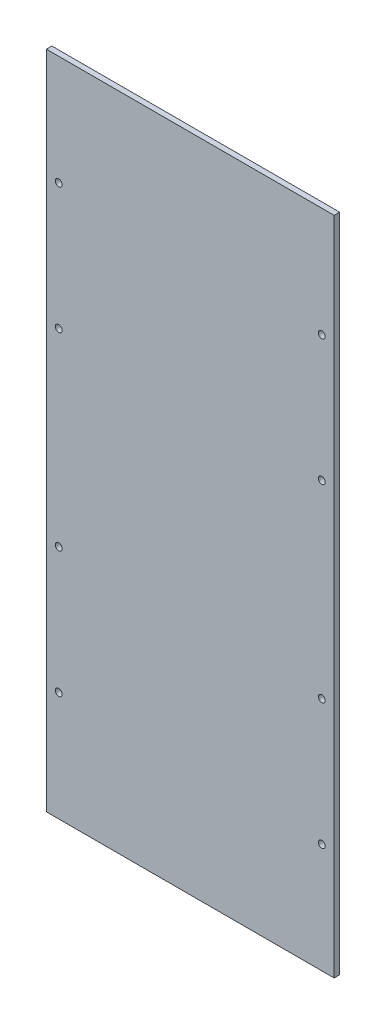
ISO-10303-21;
HEADER;
FILE_DESCRIPTION(('STEP AP214'),'2;1');
FILE_NAME('part.step','',(''),(''),'','','');
FILE_SCHEMA(('AUTOMOTIVE_DESIGN { 1 0 10303 214 1 1 1 1 }'));
ENDSEC;
DATA;
#1=APPLICATION_CONTEXT('core data for automotive mechanical design processes');
#2=APPLICATION_PROTOCOL_DEFINITION('international standard','automotive_design',2000,#1);
#3=PRODUCT_CONTEXT('',#1,'mechanical');
#4=PRODUCT('Part','Part','',(#3));
#5=PRODUCT_RELATED_PRODUCT_CATEGORY('part','',(#4));
#6=PRODUCT_DEFINITION_FORMATION('','',#4);
#7=PRODUCT_DEFINITION_CONTEXT('part definition',#1,'design');
#8=PRODUCT_DEFINITION('design','',#6,#7);
#9=PRODUCT_DEFINITION_SHAPE('','',#8);
#10=(LENGTH_UNIT() NAMED_UNIT(*) SI_UNIT(.MILLI.,.METRE.));
#11=(NAMED_UNIT(*) PLANE_ANGLE_UNIT() SI_UNIT($,.RADIAN.));
#12=(NAMED_UNIT(*) SI_UNIT($,.STERADIAN.) SOLID_ANGLE_UNIT());
#13=UNCERTAINTY_MEASURE_WITH_UNIT(LENGTH_MEASURE(1.E-05),#10,'distance_accuracy_value','');
#14=(GEOMETRIC_REPRESENTATION_CONTEXT(3) GLOBAL_UNCERTAINTY_ASSIGNED_CONTEXT((#13)) GLOBAL_UNIT_ASSIGNED_CONTEXT((#10,
#11,#12)) REPRESENTATION_CONTEXT('',''));
#15=CARTESIAN_POINT('',(0.,0.,0.));
#16=DIRECTION('',(0.,0.,1.));
#17=DIRECTION('',(1.,0.,0.));
#18=AXIS2_PLACEMENT_3D('',#15,#16,#17);
#19=CARTESIAN_POINT('',(0.,0.,4.));
#20=DIRECTION('',(0.,0.,-1.));
#21=DIRECTION('',(-1.,0.,0.));
#22=AXIS2_PLACEMENT_3D('',#19,#20,#21);
#23=PLANE('',#22);
#24=DIRECTION('',(0.,-1.,0.));
#25=VECTOR('',#24,1.);
#26=CARTESIAN_POINT('',(-90.5016149039087,703.628389677579,4.));
#27=LINE('',#26,#25);
#28=CARTESIAN_POINT('',(-90.5016149039087,1185.62838967758,4.));
#29=VERTEX_POINT('',#28);
#30=CARTESIAN_POINT('',(-90.5016149039087,703.628389677579,4.));
#31=VERTEX_POINT('',#30);
#32=EDGE_CURVE('E85',#29,#31,#27,.T.);
#33=ORIENTED_EDGE('',*,*,#32,.T.);
#34=DIRECTION('',(1.,0.,0.));
#35=VECTOR('',#34,1.);
#36=CARTESIAN_POINT('',(-90.5016149039087,703.628389677579,4.));
#37=LINE('',#36,#35);
#38=CARTESIAN_POINT('',(119.498385096091,703.628389677579,4.));
#39=VERTEX_POINT('',#38);
#40=EDGE_CURVE('E80',#31,#39,#37,.T.);
#41=ORIENTED_EDGE('',*,*,#40,.T.);
#42=DIRECTION('',(0.,1.,0.));
#43=VECTOR('',#42,1.);
#44=CARTESIAN_POINT('',(119.498385096091,703.628389677579,4.));
#45=LINE('',#44,#43);
#46=CARTESIAN_POINT('',(119.498385096091,1185.62838967758,4.));
#47=VERTEX_POINT('',#46);
#48=EDGE_CURVE('E83',#39,#47,#45,.T.);
#49=ORIENTED_EDGE('',*,*,#48,.T.);
#50=DIRECTION('',(-1.,0.,0.));
#51=VECTOR('',#50,1.);
#52=CARTESIAN_POINT('',(-90.5016149039087,1185.62838967758,4.));
#53=LINE('',#52,#51);
#54=EDGE_CURVE('E50',#47,#29,#53,.T.);
#55=ORIENTED_EDGE('',*,*,#54,.T.);
#56=EDGE_LOOP('',(#33,#41,#49,#55));
#57=FACE_BOUND('',#56,.T.);
#58=CARTESIAN_POINT('',(110.498385096091,1105.63838967758,4.));
#59=DIRECTION('',(0.,0.,1.));
#60=DIRECTION('',(1.,0.,0.));
#61=AXIS2_PLACEMENT_3D('',#58,#59,#60);
#62=CIRCLE('',#61,2.49999999999996);
#63=CARTESIAN_POINT('',(112.998385096091,1105.63838967758,4.));
#64=VERTEX_POINT('',#63);
#65=EDGE_CURVE('E100',#64,#64,#62,.T.);
#66=ORIENTED_EDGE('',*,*,#65,.F.);
#67=EDGE_LOOP('',(#66));
#68=FACE_BOUND('',#67,.T.);
#69=CARTESIAN_POINT('',(-81.5016149039087,1105.63838967758,4.));
#70=DIRECTION('',(0.,0.,1.));
#71=DIRECTION('',(1.,0.,0.));
#72=AXIS2_PLACEMENT_3D('',#69,#70,#71);
#73=CIRCLE('',#72,2.50000000000004);
#74=CARTESIAN_POINT('',(-79.0016149039087,1105.63838967758,4.));
#75=VERTEX_POINT('',#74);
#76=EDGE_CURVE('E115',#75,#75,#73,.T.);
#77=ORIENTED_EDGE('',*,*,#76,.F.);
#78=EDGE_LOOP('',(#77));
#79=FACE_BOUND('',#78,.T.);
#80=CARTESIAN_POINT('',(-81.5016149039087,1013.63838967758,4.));
#81=DIRECTION('',(0.,0.,1.));
#82=DIRECTION('',(1.,0.,0.));
#83=AXIS2_PLACEMENT_3D('',#80,#81,#82);
#84=CIRCLE('',#83,2.49999999999991);
#85=CARTESIAN_POINT('',(-79.0016149039088,1013.63838967758,4.));
#86=VERTEX_POINT('',#85);
#87=EDGE_CURVE('E121',#86,#86,#84,.T.);
#88=ORIENTED_EDGE('',*,*,#87,.F.);
#89=EDGE_LOOP('',(#88));
#90=FACE_BOUND('',#89,.T.);
#91=CARTESIAN_POINT('',(110.498385096091,1013.63838967758,4.));
#92=DIRECTION('',(0.,0.,1.));
#93=DIRECTION('',(1.,0.,0.));
#94=AXIS2_PLACEMENT_3D('',#91,#92,#93);
#95=CIRCLE('',#94,2.50000000000021);
#96=CARTESIAN_POINT('',(112.998385096092,1013.63838967758,4.));
#97=VERTEX_POINT('',#96);
#98=EDGE_CURVE('E127',#97,#97,#95,.T.);
#99=ORIENTED_EDGE('',*,*,#98,.F.);
#100=EDGE_LOOP('',(#99));
#101=FACE_BOUND('',#100,.T.);
#102=CARTESIAN_POINT('',(-81.5016149039087,875.618389677579,4.));
#103=DIRECTION('',(0.,0.,1.));
#104=DIRECTION('',(1.,0.,0.));
#105=AXIS2_PLACEMENT_3D('',#102,#103,#104);
#106=CIRCLE('',#105,2.49999999999992);
#107=CARTESIAN_POINT('',(-79.0016149039088,875.618389677579,4.));
#108=VERTEX_POINT('',#107);
#109=EDGE_CURVE('E133',#108,#108,#106,.T.);
#110=ORIENTED_EDGE('',*,*,#109,.F.);
#111=EDGE_LOOP('',(#110));
#112=FACE_BOUND('',#111,.T.);
#113=CARTESIAN_POINT('',(110.498385096091,783.618389677579,4.));
#114=DIRECTION('',(0.,0.,1.));
#115=DIRECTION('',(1.,0.,0.));
#116=AXIS2_PLACEMENT_3D('',#113,#114,#115);
#117=CIRCLE('',#116,2.49999999999998);
#118=CARTESIAN_POINT('',(112.998385096091,783.618389677579,4.));
#119=VERTEX_POINT('',#118);
#120=EDGE_CURVE('E139',#119,#119,#117,.T.);
#121=ORIENTED_EDGE('',*,*,#120,.F.);
#122=EDGE_LOOP('',(#121));
#123=FACE_BOUND('',#122,.T.);
#124=CARTESIAN_POINT('',(-81.5016149039087,783.618389677579,4.));
#125=DIRECTION('',(0.,0.,1.));
#126=DIRECTION('',(1.,0.,0.));
#127=AXIS2_PLACEMENT_3D('',#124,#125,#126);
#128=CIRCLE('',#127,2.50000000000006);
#129=CARTESIAN_POINT('',(-79.0016149039087,783.618389677579,4.));
#130=VERTEX_POINT('',#129);
#131=EDGE_CURVE('E145',#130,#130,#128,.T.);
#132=ORIENTED_EDGE('',*,*,#131,.F.);
#133=EDGE_LOOP('',(#132));
#134=FACE_BOUND('',#133,.T.);
#135=CARTESIAN_POINT('',(110.498385096091,875.618389677579,4.));
#136=DIRECTION('',(0.,0.,1.));
#137=DIRECTION('',(1.,0.,0.));
#138=AXIS2_PLACEMENT_3D('',#135,#136,#137);
#139=CIRCLE('',#138,2.50000000000001);
#140=CARTESIAN_POINT('',(112.998385096091,875.618389677579,4.));
#141=VERTEX_POINT('',#140);
#142=EDGE_CURVE('E151',#141,#141,#139,.T.);
#143=ORIENTED_EDGE('',*,*,#142,.F.);
#144=EDGE_LOOP('',(#143));
#145=FACE_BOUND('',#144,.T.);
#146=ADVANCED_FACE('F33',(#57,#68,#79,#90,#101,#112,#123,#134,#145),#23,.F.);
#147=CARTESIAN_POINT('',(0.,0.,0.));
#148=DIRECTION('',(0.,0.,-1.));
#149=DIRECTION('',(-1.,0.,0.));
#150=AXIS2_PLACEMENT_3D('',#147,#148,#149);
#151=PLANE('',#150);
#152=CARTESIAN_POINT('',(-81.5016149039087,783.618389677579,0.));
#153=DIRECTION('',(0.,0.,1.));
#154=DIRECTION('',(1.,0.,0.));
#155=AXIS2_PLACEMENT_3D('',#152,#153,#154);
#156=CIRCLE('',#155,2.50000000000006);
#157=CARTESIAN_POINT('',(-79.0016149039087,783.618389677579,0.));
#158=VERTEX_POINT('',#157);
#159=EDGE_CURVE('E148',#158,#158,#156,.T.);
#160=ORIENTED_EDGE('',*,*,#159,.T.);
#161=EDGE_LOOP('',(#160));
#162=FACE_BOUND('',#161,.T.);
#163=CARTESIAN_POINT('',(-81.5016149039087,875.618389677579,0.));
#164=DIRECTION('',(0.,0.,1.));
#165=DIRECTION('',(1.,0.,0.));
#166=AXIS2_PLACEMENT_3D('',#163,#164,#165);
#167=CIRCLE('',#166,2.49999999999992);
#168=CARTESIAN_POINT('',(-79.0016149039088,875.618389677579,0.));
#169=VERTEX_POINT('',#168);
#170=EDGE_CURVE('E136',#169,#169,#167,.T.);
#171=ORIENTED_EDGE('',*,*,#170,.T.);
#172=EDGE_LOOP('',(#171));
#173=FACE_BOUND('',#172,.T.);
#174=CARTESIAN_POINT('',(-81.5016149039087,1013.63838967758,0.));
#175=DIRECTION('',(0.,0.,1.));
#176=DIRECTION('',(1.,0.,0.));
#177=AXIS2_PLACEMENT_3D('',#174,#175,#176);
#178=CIRCLE('',#177,2.49999999999991);
#179=CARTESIAN_POINT('',(-79.0016149039088,1013.63838967758,0.));
#180=VERTEX_POINT('',#179);
#181=EDGE_CURVE('E124',#180,#180,#178,.T.);
#182=ORIENTED_EDGE('',*,*,#181,.T.);
#183=EDGE_LOOP('',(#182));
#184=FACE_BOUND('',#183,.T.);
#185=CARTESIAN_POINT('',(110.498385096091,1105.63838967758,0.));
#186=DIRECTION('',(0.,0.,1.));
#187=DIRECTION('',(1.,0.,0.));
#188=AXIS2_PLACEMENT_3D('',#185,#186,#187);
#189=CIRCLE('',#188,2.49999999999996);
#190=CARTESIAN_POINT('',(112.998385096091,1105.63838967758,0.));
#191=VERTEX_POINT('',#190);
#192=EDGE_CURVE('E112',#191,#191,#189,.T.);
#193=ORIENTED_EDGE('',*,*,#192,.T.);
#194=EDGE_LOOP('',(#193));
#195=FACE_BOUND('',#194,.T.);
#196=DIRECTION('',(0.,-1.,0.));
#197=VECTOR('',#196,1.);
#198=CARTESIAN_POINT('',(-90.5016149039087,703.628389677579,0.));
#199=LINE('',#198,#197);
#200=CARTESIAN_POINT('',(-90.5016149039087,1185.62838967758,0.));
#201=VERTEX_POINT('',#200);
#202=CARTESIAN_POINT('',(-90.5016149039087,703.628389677579,0.));
#203=VERTEX_POINT('',#202);
#204=EDGE_CURVE('E97',#201,#203,#199,.T.);
#205=ORIENTED_EDGE('',*,*,#204,.F.);
#206=DIRECTION('',(-1.,0.,0.));
#207=VECTOR('',#206,1.);
#208=CARTESIAN_POINT('',(-90.5016149039087,1185.62838967758,0.));
#209=LINE('',#208,#207);
#210=CARTESIAN_POINT('',(119.498385096091,1185.62838967758,0.));
#211=VERTEX_POINT('',#210);
#212=EDGE_CURVE('E73',#211,#201,#209,.T.);
#213=ORIENTED_EDGE('',*,*,#212,.F.);
#214=DIRECTION('',(0.,1.,0.));
#215=VECTOR('',#214,1.);
#216=CARTESIAN_POINT('',(119.498385096091,703.628389677579,0.));
#217=LINE('',#216,#215);
#218=CARTESIAN_POINT('',(119.498385096091,703.628389677579,0.));
#219=VERTEX_POINT('',#218);
#220=EDGE_CURVE('E67',#219,#211,#217,.T.);
#221=ORIENTED_EDGE('',*,*,#220,.F.);
#222=DIRECTION('',(1.,0.,0.));
#223=VECTOR('',#222,1.);
#224=CARTESIAN_POINT('',(-90.5016149039087,703.628389677579,0.));
#225=LINE('',#224,#223);
#226=EDGE_CURVE('E89',#203,#219,#225,.T.);
#227=ORIENTED_EDGE('',*,*,#226,.F.);
#228=EDGE_LOOP('',(#205,#213,#221,#227));
#229=FACE_BOUND('',#228,.T.);
#230=CARTESIAN_POINT('',(-81.5016149039087,1105.63838967758,0.));
#231=DIRECTION('',(0.,0.,1.));
#232=DIRECTION('',(1.,0.,0.));
#233=AXIS2_PLACEMENT_3D('',#230,#231,#232);
#234=CIRCLE('',#233,2.50000000000004);
#235=CARTESIAN_POINT('',(-79.0016149039087,1105.63838967758,0.));
#236=VERTEX_POINT('',#235);
#237=EDGE_CURVE('E118',#236,#236,#234,.T.);
#238=ORIENTED_EDGE('',*,*,#237,.T.);
#239=EDGE_LOOP('',(#238));
#240=FACE_BOUND('',#239,.T.);
#241=CARTESIAN_POINT('',(110.498385096091,1013.63838967758,0.));
#242=DIRECTION('',(0.,0.,1.));
#243=DIRECTION('',(1.,0.,0.));
#244=AXIS2_PLACEMENT_3D('',#241,#242,#243);
#245=CIRCLE('',#244,2.50000000000021);
#246=CARTESIAN_POINT('',(112.998385096092,1013.63838967758,0.));
#247=VERTEX_POINT('',#246);
#248=EDGE_CURVE('E130',#247,#247,#245,.T.);
#249=ORIENTED_EDGE('',*,*,#248,.T.);
#250=EDGE_LOOP('',(#249));
#251=FACE_BOUND('',#250,.T.);
#252=CARTESIAN_POINT('',(110.498385096091,783.618389677579,0.));
#253=DIRECTION('',(0.,0.,1.));
#254=DIRECTION('',(1.,0.,0.));
#255=AXIS2_PLACEMENT_3D('',#252,#253,#254);
#256=CIRCLE('',#255,2.49999999999998);
#257=CARTESIAN_POINT('',(112.998385096091,783.618389677579,0.));
#258=VERTEX_POINT('',#257);
#259=EDGE_CURVE('E142',#258,#258,#256,.T.);
#260=ORIENTED_EDGE('',*,*,#259,.T.);
#261=EDGE_LOOP('',(#260));
#262=FACE_BOUND('',#261,.T.);
#263=CARTESIAN_POINT('',(110.498385096091,875.618389677579,0.));
#264=DIRECTION('',(0.,0.,1.));
#265=DIRECTION('',(1.,0.,0.));
#266=AXIS2_PLACEMENT_3D('',#263,#264,#265);
#267=CIRCLE('',#266,2.50000000000001);
#268=CARTESIAN_POINT('',(112.998385096091,875.618389677579,0.));
#269=VERTEX_POINT('',#268);
#270=EDGE_CURVE('E154',#269,#269,#267,.T.);
#271=ORIENTED_EDGE('',*,*,#270,.T.);
#272=EDGE_LOOP('',(#271));
#273=FACE_BOUND('',#272,.T.);
#274=ADVANCED_FACE('F108',(#162,#173,#184,#195,#229,#240,#251,#262,#273),#151,.T.);
#275=CARTESIAN_POINT('',(-90.5016149039087,703.628389677579,4.));
#276=DIRECTION('',(1.,0.,0.));
#277=DIRECTION('',(0.,0.,-1.));
#278=AXIS2_PLACEMENT_3D('',#275,#276,#277);
#279=PLANE('',#278);
#280=ORIENTED_EDGE('',*,*,#204,.T.);
#281=DIRECTION('',(0.,0.,-1.));
#282=VECTOR('',#281,1.);
#283=CARTESIAN_POINT('',(-90.5016149039087,703.628389677579,4.));
#284=LINE('',#283,#282);
#285=EDGE_CURVE('E11',#31,#203,#284,.T.);
#286=ORIENTED_EDGE('',*,*,#285,.F.);
#287=ORIENTED_EDGE('',*,*,#32,.F.);
#288=DIRECTION('',(0.,0.,-1.));
#289=VECTOR('',#288,1.);
#290=CARTESIAN_POINT('',(-90.5016149039087,1185.62838967758,4.));
#291=LINE('',#290,#289);
#292=EDGE_CURVE('E93',#29,#201,#291,.T.);
#293=ORIENTED_EDGE('',*,*,#292,.T.);
#294=EDGE_LOOP('',(#280,#286,#287,#293));
#295=FACE_BOUND('',#294,.T.);
#296=ADVANCED_FACE('F35',(#295),#279,.F.);
#297=CARTESIAN_POINT('',(-90.5016149039087,703.628389677579,4.));
#298=DIRECTION('',(0.,1.,0.));
#299=DIRECTION('',(0.,0.,1.));
#300=AXIS2_PLACEMENT_3D('',#297,#298,#299);
#301=PLANE('',#300);
#302=ORIENTED_EDGE('',*,*,#226,.T.);
#303=DIRECTION('',(0.,0.,-1.));
#304=VECTOR('',#303,1.);
#305=CARTESIAN_POINT('',(119.498385096091,703.628389677579,4.));
#306=LINE('',#305,#304);
#307=EDGE_CURVE('E42',#39,#219,#306,.T.);
#308=ORIENTED_EDGE('',*,*,#307,.F.);
#309=ORIENTED_EDGE('',*,*,#40,.F.);
#310=ORIENTED_EDGE('',*,*,#285,.T.);
#311=EDGE_LOOP('',(#302,#308,#309,#310));
#312=FACE_BOUND('',#311,.T.);
#313=ADVANCED_FACE('F88',(#312),#301,.F.);
#314=CARTESIAN_POINT('',(119.498385096091,703.628389677579,4.));
#315=DIRECTION('',(-1.,0.,0.));
#316=DIRECTION('',(0.,0.,1.));
#317=AXIS2_PLACEMENT_3D('',#314,#315,#316);
#318=PLANE('',#317);
#319=ORIENTED_EDGE('',*,*,#220,.T.);
#320=DIRECTION('',(0.,0.,-1.));
#321=VECTOR('',#320,1.);
#322=CARTESIAN_POINT('',(119.498385096091,1185.62838967758,4.));
#323=LINE('',#322,#321);
#324=EDGE_CURVE('E90',#47,#211,#323,.T.);
#325=ORIENTED_EDGE('',*,*,#324,.F.);
#326=ORIENTED_EDGE('',*,*,#48,.F.);
#327=ORIENTED_EDGE('',*,*,#307,.T.);
#328=EDGE_LOOP('',(#319,#325,#326,#327));
#329=FACE_BOUND('',#328,.T.);
#330=ADVANCED_FACE('F91',(#329),#318,.F.);
#331=CARTESIAN_POINT('',(-90.5016149039087,1185.62838967758,4.));
#332=DIRECTION('',(0.,-1.,0.));
#333=DIRECTION('',(0.,0.,-1.));
#334=AXIS2_PLACEMENT_3D('',#331,#332,#333);
#335=PLANE('',#334);
#336=ORIENTED_EDGE('',*,*,#212,.T.);
#337=ORIENTED_EDGE('',*,*,#292,.F.);
#338=ORIENTED_EDGE('',*,*,#54,.F.);
#339=ORIENTED_EDGE('',*,*,#324,.T.);
#340=EDGE_LOOP('',(#336,#337,#338,#339));
#341=FACE_BOUND('',#340,.T.);
#342=ADVANCED_FACE('F105',(#341),#335,.F.);
#343=CARTESIAN_POINT('',(110.498385096091,1105.63838967758,4.));
#344=DIRECTION('',(0.,0.,-1.));
#345=DIRECTION('',(-1.,0.,0.));
#346=AXIS2_PLACEMENT_3D('',#343,#344,#345);
#347=CYLINDRICAL_SURFACE('',#346,2.49999999999996);
#348=ORIENTED_EDGE('',*,*,#65,.T.);
#349=EDGE_LOOP('',(#348));
#350=FACE_BOUND('',#349,.T.);
#351=ORIENTED_EDGE('',*,*,#192,.F.);
#352=EDGE_LOOP('',(#351));
#353=FACE_BOUND('',#352,.T.);
#354=ADVANCED_FACE('F171',(#350,#353),#347,.F.);
#355=CARTESIAN_POINT('',(-81.5016149039087,1105.63838967758,4.));
#356=DIRECTION('',(0.,0.,-1.));
#357=DIRECTION('',(-1.,0.,0.));
#358=AXIS2_PLACEMENT_3D('',#355,#356,#357);
#359=CYLINDRICAL_SURFACE('',#358,2.50000000000004);
#360=ORIENTED_EDGE('',*,*,#76,.T.);
#361=EDGE_LOOP('',(#360));
#362=FACE_BOUND('',#361,.T.);
#363=ORIENTED_EDGE('',*,*,#237,.F.);
#364=EDGE_LOOP('',(#363));
#365=FACE_BOUND('',#364,.T.);
#366=ADVANCED_FACE('F217',(#362,#365),#359,.F.);
#367=CARTESIAN_POINT('',(-81.5016149039087,1013.63838967758,4.));
#368=DIRECTION('',(0.,0.,-1.));
#369=DIRECTION('',(-1.,0.,0.));
#370=AXIS2_PLACEMENT_3D('',#367,#368,#369);
#371=CYLINDRICAL_SURFACE('',#370,2.49999999999991);
#372=ORIENTED_EDGE('',*,*,#87,.T.);
#373=EDGE_LOOP('',(#372));
#374=FACE_BOUND('',#373,.T.);
#375=ORIENTED_EDGE('',*,*,#181,.F.);
#376=EDGE_LOOP('',(#375));
#377=FACE_BOUND('',#376,.T.);
#378=ADVANCED_FACE('F225',(#374,#377),#371,.F.);
#379=CARTESIAN_POINT('',(110.498385096091,1013.63838967758,4.));
#380=DIRECTION('',(0.,0.,-1.));
#381=DIRECTION('',(-1.,0.,0.));
#382=AXIS2_PLACEMENT_3D('',#379,#380,#381);
#383=CYLINDRICAL_SURFACE('',#382,2.50000000000021);
#384=ORIENTED_EDGE('',*,*,#98,.T.);
#385=EDGE_LOOP('',(#384));
#386=FACE_BOUND('',#385,.T.);
#387=ORIENTED_EDGE('',*,*,#248,.F.);
#388=EDGE_LOOP('',(#387));
#389=FACE_BOUND('',#388,.T.);
#390=ADVANCED_FACE('F233',(#386,#389),#383,.F.);
#391=CARTESIAN_POINT('',(-81.5016149039087,875.618389677579,4.));
#392=DIRECTION('',(0.,0.,-1.));
#393=DIRECTION('',(-1.,0.,0.));
#394=AXIS2_PLACEMENT_3D('',#391,#392,#393);
#395=CYLINDRICAL_SURFACE('',#394,2.49999999999992);
#396=ORIENTED_EDGE('',*,*,#109,.T.);
#397=EDGE_LOOP('',(#396));
#398=FACE_BOUND('',#397,.T.);
#399=ORIENTED_EDGE('',*,*,#170,.F.);
#400=EDGE_LOOP('',(#399));
#401=FACE_BOUND('',#400,.T.);
#402=ADVANCED_FACE('F242',(#398,#401),#395,.F.);
#403=CARTESIAN_POINT('',(110.498385096091,783.618389677579,4.));
#404=DIRECTION('',(0.,0.,-1.));
#405=DIRECTION('',(-1.,0.,0.));
#406=AXIS2_PLACEMENT_3D('',#403,#404,#405);
#407=CYLINDRICAL_SURFACE('',#406,2.49999999999998);
#408=ORIENTED_EDGE('',*,*,#120,.T.);
#409=EDGE_LOOP('',(#408));
#410=FACE_BOUND('',#409,.T.);
#411=ORIENTED_EDGE('',*,*,#259,.F.);
#412=EDGE_LOOP('',(#411));
#413=FACE_BOUND('',#412,.T.);
#414=ADVANCED_FACE('F251',(#410,#413),#407,.F.);
#415=CARTESIAN_POINT('',(-81.5016149039087,783.618389677579,4.));
#416=DIRECTION('',(0.,0.,-1.));
#417=DIRECTION('',(-1.,0.,0.));
#418=AXIS2_PLACEMENT_3D('',#415,#416,#417);
#419=CYLINDRICAL_SURFACE('',#418,2.50000000000006);
#420=ORIENTED_EDGE('',*,*,#131,.T.);
#421=EDGE_LOOP('',(#420));
#422=FACE_BOUND('',#421,.T.);
#423=ORIENTED_EDGE('',*,*,#159,.F.);
#424=EDGE_LOOP('',(#423));
#425=FACE_BOUND('',#424,.T.);
#426=ADVANCED_FACE('F260',(#422,#425),#419,.F.);
#427=CARTESIAN_POINT('',(110.498385096091,875.618389677579,4.));
#428=DIRECTION('',(0.,0.,-1.));
#429=DIRECTION('',(-1.,0.,0.));
#430=AXIS2_PLACEMENT_3D('',#427,#428,#429);
#431=CYLINDRICAL_SURFACE('',#430,2.50000000000001);
#432=ORIENTED_EDGE('',*,*,#142,.T.);
#433=EDGE_LOOP('',(#432));
#434=FACE_BOUND('',#433,.T.);
#435=ORIENTED_EDGE('',*,*,#270,.F.);
#436=EDGE_LOOP('',(#435));
#437=FACE_BOUND('',#436,.T.);
#438=ADVANCED_FACE('F160',(#434,#437),#431,.F.);
#439=CLOSED_SHELL('',(#146,#274,#296,#313,#330,#342,#354,#366,#378,#390,#402,#414,#426,#438));
#440=MANIFOLD_SOLID_BREP('B2',#439);
#441=ADVANCED_BREP_SHAPE_REPRESENTATION('',(#18,#440),#14);
#442=SHAPE_DEFINITION_REPRESENTATION(#9,#441);
ENDSEC;
END-ISO-10303-21;
